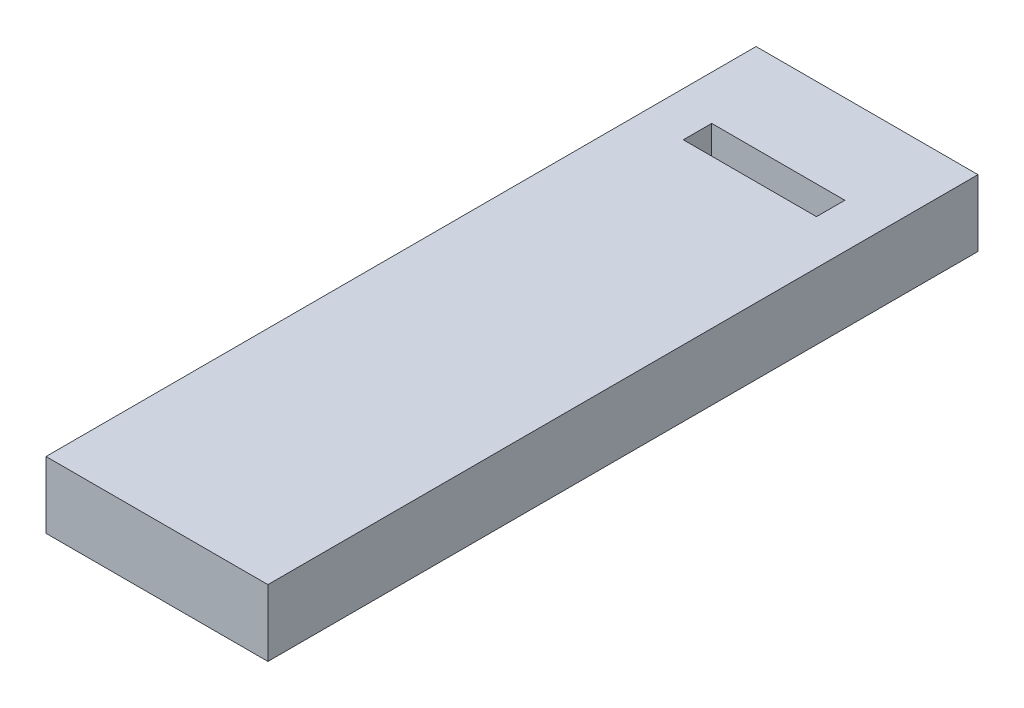
ISO-10303-21;
HEADER;
FILE_DESCRIPTION(('STEP AP214'),'2;1');
FILE_NAME('part.step','',(''),(''),'','','');
FILE_SCHEMA(('AUTOMOTIVE_DESIGN { 1 0 10303 214 1 1 1 1 }'));
ENDSEC;
DATA;
#1=APPLICATION_CONTEXT('core data for automotive mechanical design processes');
#2=APPLICATION_PROTOCOL_DEFINITION('international standard','automotive_design',2000,#1);
#3=PRODUCT_CONTEXT('',#1,'mechanical');
#4=PRODUCT('Part','Part','',(#3));
#5=PRODUCT_RELATED_PRODUCT_CATEGORY('part','',(#4));
#6=PRODUCT_DEFINITION_FORMATION('','',#4);
#7=PRODUCT_DEFINITION_CONTEXT('part definition',#1,'design');
#8=PRODUCT_DEFINITION('design','',#6,#7);
#9=PRODUCT_DEFINITION_SHAPE('','',#8);
#10=(LENGTH_UNIT() NAMED_UNIT(*) SI_UNIT(.MILLI.,.METRE.));
#11=(NAMED_UNIT(*) PLANE_ANGLE_UNIT() SI_UNIT($,.RADIAN.));
#12=(NAMED_UNIT(*) SI_UNIT($,.STERADIAN.) SOLID_ANGLE_UNIT());
#13=UNCERTAINTY_MEASURE_WITH_UNIT(LENGTH_MEASURE(1.E-05),#10,'distance_accuracy_value','');
#14=(GEOMETRIC_REPRESENTATION_CONTEXT(3) GLOBAL_UNCERTAINTY_ASSIGNED_CONTEXT((#13)) GLOBAL_UNIT_ASSIGNED_CONTEXT((#10,
#11,#12)) REPRESENTATION_CONTEXT('',''));
#15=CARTESIAN_POINT('',(0.,0.,0.));
#16=DIRECTION('',(0.,0.,1.));
#17=DIRECTION('',(1.,0.,0.));
#18=AXIS2_PLACEMENT_3D('',#15,#16,#17);
#19=CARTESIAN_POINT('',(0.,0.,0.));
#20=DIRECTION('',(0.,-1.,0.));
#21=DIRECTION('',(0.,0.,-1.));
#22=AXIS2_PLACEMENT_3D('',#19,#20,#21);
#23=PLANE('',#22);
#24=CARTESIAN_POINT('',(-23.8125,0.,-73.025));
#25=DIRECTION('',(0.,-1.,0.));
#26=DIRECTION('',(0.,0.,-1.));
#27=AXIS2_PLACEMENT_3D('',#24,#25,#26);
#28=CIRCLE('',#27,3.175);
#29=CARTESIAN_POINT('',(-26.9875,0.,-73.025));
#30=VERTEX_POINT('',#29);
#31=CARTESIAN_POINT('',(-23.8125,0.,-76.2));
#32=VERTEX_POINT('',#31);
#33=EDGE_CURVE('E335',#30,#32,#28,.T.);
#34=ORIENTED_EDGE('',*,*,#33,.F.);
#35=DIRECTION('',(0.,0.,-1.));
#36=VECTOR('',#35,1.);
#37=CARTESIAN_POINT('',(-26.9875,0.,90.4875));
#38=LINE('',#37,#36);
#39=CARTESIAN_POINT('',(-26.9875,0.,90.4875));
#40=VERTEX_POINT('',#39);
#41=EDGE_CURVE('E390',#40,#30,#38,.T.);
#42=ORIENTED_EDGE('',*,*,#41,.F.);
#43=CARTESIAN_POINT('',(-20.6375,0.,90.4875));
#44=DIRECTION('',(0.,-1.,0.));
#45=DIRECTION('',(0.,0.,-1.));
#46=AXIS2_PLACEMENT_3D('',#43,#44,#45);
#47=CIRCLE('',#46,6.35);
#48=CARTESIAN_POINT('',(-20.6375,0.,96.8375));
#49=VERTEX_POINT('',#48);
#50=EDGE_CURVE('E387',#49,#40,#47,.T.);
#51=ORIENTED_EDGE('',*,*,#50,.F.);
#52=DIRECTION('',(-1.,0.,0.));
#53=VECTOR('',#52,1.);
#54=CARTESIAN_POINT('',(20.6375,0.,96.8375));
#55=LINE('',#54,#53);
#56=CARTESIAN_POINT('',(20.6375,0.,96.8375));
#57=VERTEX_POINT('',#56);
#58=EDGE_CURVE('E384',#57,#49,#55,.T.);
#59=ORIENTED_EDGE('',*,*,#58,.F.);
#60=CARTESIAN_POINT('',(20.6375,0.,90.4875));
#61=DIRECTION('',(0.,-1.,0.));
#62=DIRECTION('',(0.,0.,-1.));
#63=AXIS2_PLACEMENT_3D('',#60,#61,#62);
#64=CIRCLE('',#63,6.35);
#65=CARTESIAN_POINT('',(26.9875,0.,90.4875));
#66=VERTEX_POINT('',#65);
#67=EDGE_CURVE('E346',#66,#57,#64,.T.);
#68=ORIENTED_EDGE('',*,*,#67,.F.);
#69=DIRECTION('',(0.,0.,1.));
#70=VECTOR('',#69,1.);
#71=CARTESIAN_POINT('',(26.9875,0.,90.4875));
#72=LINE('',#71,#70);
#73=CARTESIAN_POINT('',(26.9875,0.,-73.025));
#74=VERTEX_POINT('',#73);
#75=EDGE_CURVE('E366',#74,#66,#72,.T.);
#76=ORIENTED_EDGE('',*,*,#75,.F.);
#77=CARTESIAN_POINT('',(23.8125,0.,-73.025));
#78=DIRECTION('',(0.,-1.,0.));
#79=DIRECTION('',(0.,0.,-1.));
#80=AXIS2_PLACEMENT_3D('',#77,#78,#79);
#81=CIRCLE('',#80,3.175);
#82=CARTESIAN_POINT('',(23.8125,0.,-76.2));
#83=VERTEX_POINT('',#82);
#84=EDGE_CURVE('E316',#83,#74,#81,.T.);
#85=ORIENTED_EDGE('',*,*,#84,.F.);
#86=DIRECTION('',(1.,0.,0.));
#87=VECTOR('',#86,1.);
#88=CARTESIAN_POINT('',(23.8125,0.,-76.2));
#89=LINE('',#88,#87);
#90=CARTESIAN_POINT('',(4.76250000000001,0.,-76.2));
#91=VERTEX_POINT('',#90);
#92=EDGE_CURVE('E338',#91,#83,#89,.T.);
#93=ORIENTED_EDGE('',*,*,#92,.F.);
#94=DIRECTION('',(0.,0.,-1.));
#95=VECTOR('',#94,1.);
#96=CARTESIAN_POINT('',(4.76250000000001,0.,-76.2));
#97=LINE('',#96,#95);
#98=CARTESIAN_POINT('',(4.76250000000001,0.,-101.6));
#99=VERTEX_POINT('',#98);
#100=EDGE_CURVE('E281',#99,#91,#97,.F.);
#101=ORIENTED_EDGE('',*,*,#100,.F.);
#102=DIRECTION('',(-1.,0.,0.));
#103=VECTOR('',#102,1.);
#104=CARTESIAN_POINT('',(-31.75,0.,-101.6));
#105=LINE('',#104,#103);
#106=CARTESIAN_POINT('',(31.75,0.,-101.6));
#107=VERTEX_POINT('',#106);
#108=EDGE_CURVE('E264',#107,#99,#105,.T.);
#109=ORIENTED_EDGE('',*,*,#108,.F.);
#110=DIRECTION('',(0.,0.,-1.));
#111=VECTOR('',#110,1.);
#112=CARTESIAN_POINT('',(31.75,0.,101.6));
#113=LINE('',#112,#111);
#114=CARTESIAN_POINT('',(31.75,0.,101.6));
#115=VERTEX_POINT('',#114);
#116=EDGE_CURVE('E246',#115,#107,#113,.T.);
#117=ORIENTED_EDGE('',*,*,#116,.F.);
#118=DIRECTION('',(1.,0.,0.));
#119=VECTOR('',#118,1.);
#120=CARTESIAN_POINT('',(-31.75,0.,101.6));
#121=LINE('',#120,#119);
#122=CARTESIAN_POINT('',(-31.75,0.,101.6));
#123=VERTEX_POINT('',#122);
#124=EDGE_CURVE('E254',#123,#115,#121,.T.);
#125=ORIENTED_EDGE('',*,*,#124,.F.);
#126=DIRECTION('',(0.,0.,1.));
#127=VECTOR('',#126,1.);
#128=CARTESIAN_POINT('',(-31.75,0.,101.6));
#129=LINE('',#128,#127);
#130=CARTESIAN_POINT('',(-31.75,0.,-101.6));
#131=VERTEX_POINT('',#130);
#132=EDGE_CURVE('E267',#131,#123,#129,.T.);
#133=ORIENTED_EDGE('',*,*,#132,.F.);
#134=CARTESIAN_POINT('',(-4.76249999999999,0.,-101.6));
#135=VERTEX_POINT('',#134);
#136=EDGE_CURVE('E263',#135,#131,#105,.T.);
#137=ORIENTED_EDGE('',*,*,#136,.F.);
#138=DIRECTION('',(0.,0.,-1.));
#139=VECTOR('',#138,1.);
#140=CARTESIAN_POINT('',(-4.76249999999999,0.,-76.2));
#141=LINE('',#140,#139);
#142=CARTESIAN_POINT('',(-4.76249999999999,0.,-76.2));
#143=VERTEX_POINT('',#142);
#144=EDGE_CURVE('E284',#143,#135,#141,.T.);
#145=ORIENTED_EDGE('',*,*,#144,.F.);
#146=EDGE_CURVE('E339',#32,#143,#89,.T.);
#147=ORIENTED_EDGE('',*,*,#146,.F.);
#148=EDGE_LOOP('',(#34,#42,#51,#59,#68,#76,#85,#93,#101,#109,#117,#125,#133,#137,#145,#147));
#149=FACE_BOUND('',#148,.T.);
#150=ADVANCED_FACE('F33',(#149),#23,.T.);
#151=CARTESIAN_POINT('',(0.,19.05,0.));
#152=DIRECTION('',(0.,-1.,0.));
#153=DIRECTION('',(0.,0.,-1.));
#154=AXIS2_PLACEMENT_3D('',#151,#152,#153);
#155=PLANE('',#154);
#156=DIRECTION('',(0.,0.,-1.));
#157=VECTOR('',#156,1.);
#158=CARTESIAN_POINT('',(31.75,19.05,101.6));
#159=LINE('',#158,#157);
#160=CARTESIAN_POINT('',(31.75,19.05,101.6));
#161=VERTEX_POINT('',#160);
#162=CARTESIAN_POINT('',(31.75,19.05,-101.6));
#163=VERTEX_POINT('',#162);
#164=EDGE_CURVE('E250',#161,#163,#159,.T.);
#165=ORIENTED_EDGE('',*,*,#164,.T.);
#166=DIRECTION('',(-1.,0.,0.));
#167=VECTOR('',#166,1.);
#168=CARTESIAN_POINT('',(-31.75,19.05,-101.6));
#169=LINE('',#168,#167);
#170=CARTESIAN_POINT('',(-31.75,19.05,-101.6));
#171=VERTEX_POINT('',#170);
#172=EDGE_CURVE('E253',#163,#171,#169,.T.);
#173=ORIENTED_EDGE('',*,*,#172,.T.);
#174=DIRECTION('',(0.,0.,1.));
#175=VECTOR('',#174,1.);
#176=CARTESIAN_POINT('',(-31.75,19.05,101.6));
#177=LINE('',#176,#175);
#178=CARTESIAN_POINT('',(-31.75,19.05,101.6));
#179=VERTEX_POINT('',#178);
#180=EDGE_CURVE('E256',#171,#179,#177,.T.);
#181=ORIENTED_EDGE('',*,*,#180,.T.);
#182=DIRECTION('',(1.,0.,0.));
#183=VECTOR('',#182,1.);
#184=CARTESIAN_POINT('',(-31.75,19.05,101.6));
#185=LINE('',#184,#183);
#186=EDGE_CURVE('E258',#179,#161,#185,.T.);
#187=ORIENTED_EDGE('',*,*,#186,.T.);
#188=EDGE_LOOP('',(#165,#173,#181,#187));
#189=FACE_BOUND('',#188,.T.);
#190=DIRECTION('',(0.,0.,-1.));
#191=VECTOR('',#190,1.);
#192=CARTESIAN_POINT('',(19.05,19.05,-76.2));
#193=LINE('',#192,#191);
#194=CARTESIAN_POINT('',(19.05,19.05,-68.072));
#195=VERTEX_POINT('',#194);
#196=CARTESIAN_POINT('',(19.05,19.05,-76.2));
#197=VERTEX_POINT('',#196);
#198=EDGE_CURVE('E406',#195,#197,#193,.T.);
#199=ORIENTED_EDGE('',*,*,#198,.F.);
#200=DIRECTION('',(1.,0.,0.));
#201=VECTOR('',#200,1.);
#202=CARTESIAN_POINT('',(19.05,19.05,-68.072));
#203=LINE('',#202,#201);
#204=CARTESIAN_POINT('',(-19.05,19.05,-68.072));
#205=VERTEX_POINT('',#204);
#206=EDGE_CURVE('E415',#205,#195,#203,.T.);
#207=ORIENTED_EDGE('',*,*,#206,.F.);
#208=DIRECTION('',(0.,0.,1.));
#209=VECTOR('',#208,1.);
#210=CARTESIAN_POINT('',(-19.05,19.05,-76.2));
#211=LINE('',#210,#209);
#212=CARTESIAN_POINT('',(-19.05,19.05,-76.2));
#213=VERTEX_POINT('',#212);
#214=EDGE_CURVE('E413',#213,#205,#211,.T.);
#215=ORIENTED_EDGE('',*,*,#214,.F.);
#216=DIRECTION('',(-1.,0.,0.));
#217=VECTOR('',#216,1.);
#218=CARTESIAN_POINT('',(19.05,19.05,-76.2));
#219=LINE('',#218,#217);
#220=EDGE_CURVE('E411',#197,#213,#219,.T.);
#221=ORIENTED_EDGE('',*,*,#220,.F.);
#222=EDGE_LOOP('',(#199,#207,#215,#221));
#223=FACE_BOUND('',#222,.T.);
#224=ADVANCED_FACE('F426',(#189,#223),#155,.F.);
#225=CARTESIAN_POINT('',(-23.8125,9.525,-73.025));
#226=DIRECTION('',(0.,-1.,0.));
#227=DIRECTION('',(0.,0.,-1.));
#228=AXIS2_PLACEMENT_3D('',#225,#226,#227);
#229=PLANE('',#228);
#230=DIRECTION('',(-1.,0.,0.));
#231=VECTOR('',#230,1.);
#232=CARTESIAN_POINT('',(-23.8125,9.525,-68.072));
#233=LINE('',#232,#231);
#234=CARTESIAN_POINT('',(23.8125,9.525,-68.072));
#235=VERTEX_POINT('',#234);
#236=CARTESIAN_POINT('',(19.05,9.525,-68.072));
#237=VERTEX_POINT('',#236);
#238=EDGE_CURVE('E299',#235,#237,#233,.T.);
#239=ORIENTED_EDGE('',*,*,#238,.T.);
#240=DIRECTION('',(0.,0.,-1.));
#241=VECTOR('',#240,1.);
#242=CARTESIAN_POINT('',(19.05,9.525,-73.0249999999999));
#243=LINE('',#242,#241);
#244=CARTESIAN_POINT('',(19.05,9.525,-76.2));
#245=VERTEX_POINT('',#244);
#246=EDGE_CURVE('E41',#237,#245,#243,.T.);
#247=ORIENTED_EDGE('',*,*,#246,.T.);
#248=DIRECTION('',(1.,0.,0.));
#249=VECTOR('',#248,1.);
#250=CARTESIAN_POINT('',(23.8125,9.525,-76.2));
#251=LINE('',#250,#249);
#252=CARTESIAN_POINT('',(23.8125,9.525,-76.2));
#253=VERTEX_POINT('',#252);
#254=EDGE_CURVE('E295',#245,#253,#251,.T.);
#255=ORIENTED_EDGE('',*,*,#254,.T.);
#256=CARTESIAN_POINT('',(23.8125,9.525,-73.025));
#257=DIRECTION('',(0.,-1.,0.));
#258=DIRECTION('',(0.,0.,-1.));
#259=AXIS2_PLACEMENT_3D('',#256,#257,#258);
#260=CIRCLE('',#259,3.175);
#261=CARTESIAN_POINT('',(26.9875,9.525,-73.025));
#262=VERTEX_POINT('',#261);
#263=EDGE_CURVE('E314',#253,#262,#260,.T.);
#264=ORIENTED_EDGE('',*,*,#263,.T.);
#265=DIRECTION('',(0.,0.,1.));
#266=VECTOR('',#265,1.);
#267=CARTESIAN_POINT('',(26.9875,9.525,-71.247));
#268=LINE('',#267,#266);
#269=CARTESIAN_POINT('',(26.9875,9.525,-71.247));
#270=VERTEX_POINT('',#269);
#271=EDGE_CURVE('E321',#262,#270,#268,.T.);
#272=ORIENTED_EDGE('',*,*,#271,.T.);
#273=CARTESIAN_POINT('',(23.8125,9.525,-71.247));
#274=DIRECTION('',(0.,-1.,0.));
#275=DIRECTION('',(0.,0.,1.));
#276=AXIS2_PLACEMENT_3D('',#273,#274,#275);
#277=CIRCLE('',#276,3.17499999999999);
#278=EDGE_CURVE('E324',#270,#235,#277,.T.);
#279=ORIENTED_EDGE('',*,*,#278,.T.);
#280=EDGE_LOOP('',(#239,#247,#255,#264,#272,#279));
#281=FACE_BOUND('',#280,.T.);
#282=ADVANCED_FACE('F293',(#281),#229,.T.);
#283=CARTESIAN_POINT('',(-23.8125,9.525,-76.2));
#284=VERTEX_POINT('',#283);
#285=CARTESIAN_POINT('',(-19.05,9.525,-76.2));
#286=VERTEX_POINT('',#285);
#287=EDGE_CURVE('E310',#284,#286,#251,.T.);
#288=ORIENTED_EDGE('',*,*,#287,.T.);
#289=DIRECTION('',(0.,0.,1.));
#290=VECTOR('',#289,1.);
#291=CARTESIAN_POINT('',(-19.05,9.525,-73.025));
#292=LINE('',#291,#290);
#293=CARTESIAN_POINT('',(-19.05,9.525,-68.072));
#294=VERTEX_POINT('',#293);
#295=EDGE_CURVE('E286',#286,#294,#292,.T.);
#296=ORIENTED_EDGE('',*,*,#295,.T.);
#297=CARTESIAN_POINT('',(-23.8125,9.525,-68.072));
#298=VERTEX_POINT('',#297);
#299=EDGE_CURVE('E326',#294,#298,#233,.T.);
#300=ORIENTED_EDGE('',*,*,#299,.T.);
#301=CARTESIAN_POINT('',(-23.8125,9.525,-71.247));
#302=DIRECTION('',(0.,-1.,0.));
#303=DIRECTION('',(0.,0.,-1.));
#304=AXIS2_PLACEMENT_3D('',#301,#302,#303);
#305=CIRCLE('',#304,3.175);
#306=CARTESIAN_POINT('',(-26.9875,9.525,-71.247));
#307=VERTEX_POINT('',#306);
#308=EDGE_CURVE('E328',#298,#307,#305,.T.);
#309=ORIENTED_EDGE('',*,*,#308,.T.);
#310=DIRECTION('',(0.,0.,-1.));
#311=VECTOR('',#310,1.);
#312=CARTESIAN_POINT('',(-26.9875,9.525,-71.247));
#313=LINE('',#312,#311);
#314=CARTESIAN_POINT('',(-26.9875,9.525,-73.025));
#315=VERTEX_POINT('',#314);
#316=EDGE_CURVE('E331',#307,#315,#313,.T.);
#317=ORIENTED_EDGE('',*,*,#316,.T.);
#318=CARTESIAN_POINT('',(-23.8125,9.525,-73.025));
#319=DIRECTION('',(0.,-1.,0.));
#320=DIRECTION('',(0.,0.,-1.));
#321=AXIS2_PLACEMENT_3D('',#318,#319,#320);
#322=CIRCLE('',#321,3.175);
#323=EDGE_CURVE('E311',#315,#284,#322,.T.);
#324=ORIENTED_EDGE('',*,*,#323,.T.);
#325=EDGE_LOOP('',(#288,#296,#300,#309,#317,#324));
#326=FACE_BOUND('',#325,.T.);
#327=ADVANCED_FACE('F433',(#326),#229,.T.);
#328=CARTESIAN_POINT('',(31.75,19.05,101.6));
#329=DIRECTION('',(-1.,0.,0.));
#330=DIRECTION('',(0.,0.,1.));
#331=AXIS2_PLACEMENT_3D('',#328,#329,#330);
#332=PLANE('',#331);
#333=ORIENTED_EDGE('',*,*,#116,.T.);
#334=DIRECTION('',(0.,-1.,0.));
#335=VECTOR('',#334,1.);
#336=CARTESIAN_POINT('',(31.75,19.05,-101.6));
#337=LINE('',#336,#335);
#338=EDGE_CURVE('E278',#163,#107,#337,.T.);
#339=ORIENTED_EDGE('',*,*,#338,.F.);
#340=ORIENTED_EDGE('',*,*,#164,.F.);
#341=DIRECTION('',(0.,-1.,0.));
#342=VECTOR('',#341,1.);
#343=CARTESIAN_POINT('',(31.75,19.05,101.6));
#344=LINE('',#343,#342);
#345=EDGE_CURVE('E260',#161,#115,#344,.T.);
#346=ORIENTED_EDGE('',*,*,#345,.T.);
#347=EDGE_LOOP('',(#333,#339,#340,#346));
#348=FACE_BOUND('',#347,.T.);
#349=ADVANCED_FACE('F35',(#348),#332,.F.);
#350=CARTESIAN_POINT('',(-31.75,19.05,-101.6));
#351=DIRECTION('',(0.,0.,1.));
#352=DIRECTION('',(1.,0.,0.));
#353=AXIS2_PLACEMENT_3D('',#350,#351,#352);
#354=PLANE('',#353);
#355=ORIENTED_EDGE('',*,*,#108,.T.);
#356=CARTESIAN_POINT('',(0.,0.,-101.6));
#357=DIRECTION('',(0.,0.,-1.));
#358=DIRECTION('',(-1.,0.,0.));
#359=AXIS2_PLACEMENT_3D('',#356,#357,#358);
#360=CIRCLE('',#359,4.7625);
#361=EDGE_CURVE('E247',#135,#99,#360,.T.);
#362=ORIENTED_EDGE('',*,*,#361,.F.);
#363=ORIENTED_EDGE('',*,*,#136,.T.);
#364=DIRECTION('',(0.,-1.,0.));
#365=VECTOR('',#364,1.);
#366=CARTESIAN_POINT('',(-31.75,19.05,-101.6));
#367=LINE('',#366,#365);
#368=EDGE_CURVE('E275',#171,#131,#367,.T.);
#369=ORIENTED_EDGE('',*,*,#368,.F.);
#370=ORIENTED_EDGE('',*,*,#172,.F.);
#371=ORIENTED_EDGE('',*,*,#338,.T.);
#372=EDGE_LOOP('',(#355,#362,#363,#369,#370,#371));
#373=FACE_BOUND('',#372,.T.);
#374=ADVANCED_FACE('F460',(#373),#354,.F.);
#375=CARTESIAN_POINT('',(-31.75,19.05,101.6));
#376=DIRECTION('',(1.,0.,0.));
#377=DIRECTION('',(0.,0.,-1.));
#378=AXIS2_PLACEMENT_3D('',#375,#376,#377);
#379=PLANE('',#378);
#380=ORIENTED_EDGE('',*,*,#132,.T.);
#381=DIRECTION('',(0.,-1.,0.));
#382=VECTOR('',#381,1.);
#383=CARTESIAN_POINT('',(-31.75,19.05,101.6));
#384=LINE('',#383,#382);
#385=EDGE_CURVE('E272',#179,#123,#384,.T.);
#386=ORIENTED_EDGE('',*,*,#385,.F.);
#387=ORIENTED_EDGE('',*,*,#180,.F.);
#388=ORIENTED_EDGE('',*,*,#368,.T.);
#389=EDGE_LOOP('',(#380,#386,#387,#388));
#390=FACE_BOUND('',#389,.T.);
#391=ADVANCED_FACE('F463',(#390),#379,.F.);
#392=CARTESIAN_POINT('',(-31.75,19.05,101.6));
#393=DIRECTION('',(0.,0.,-1.));
#394=DIRECTION('',(-1.,0.,0.));
#395=AXIS2_PLACEMENT_3D('',#392,#393,#394);
#396=PLANE('',#395);
#397=ORIENTED_EDGE('',*,*,#124,.T.);
#398=ORIENTED_EDGE('',*,*,#345,.F.);
#399=ORIENTED_EDGE('',*,*,#186,.F.);
#400=ORIENTED_EDGE('',*,*,#385,.T.);
#401=EDGE_LOOP('',(#397,#398,#399,#400));
#402=FACE_BOUND('',#401,.T.);
#403=ADVANCED_FACE('F498',(#402),#396,.F.);
#404=CARTESIAN_POINT('',(0.,0.,-76.2));
#405=DIRECTION('',(0.,0.,-1.));
#406=DIRECTION('',(-1.,0.,0.));
#407=AXIS2_PLACEMENT_3D('',#404,#405,#406);
#408=CYLINDRICAL_SURFACE('',#407,4.7625);
#409=ORIENTED_EDGE('',*,*,#144,.T.);
#410=ORIENTED_EDGE('',*,*,#361,.T.);
#411=ORIENTED_EDGE('',*,*,#100,.T.);
#412=CARTESIAN_POINT('',(0.,0.,-76.2));
#413=DIRECTION('',(0.,0.,-1.));
#414=DIRECTION('',(-1.,0.,0.));
#415=AXIS2_PLACEMENT_3D('',#412,#413,#414);
#416=CIRCLE('',#415,4.7625);
#417=EDGE_CURVE('E244',#143,#91,#416,.T.);
#418=ORIENTED_EDGE('',*,*,#417,.F.);
#419=EDGE_LOOP('',(#409,#410,#411,#418));
#420=FACE_BOUND('',#419,.T.);
#421=ADVANCED_FACE('F452',(#420),#408,.F.);
#422=CARTESIAN_POINT('',(20.6375,9.525,90.4875));
#423=DIRECTION('',(0.,-1.,0.));
#424=DIRECTION('',(0.,0.,-1.));
#425=AXIS2_PLACEMENT_3D('',#422,#423,#424);
#426=CYLINDRICAL_SURFACE('',#425,6.35);
#427=ORIENTED_EDGE('',*,*,#67,.T.);
#428=DIRECTION('',(0.,-1.,0.));
#429=VECTOR('',#428,1.);
#430=CARTESIAN_POINT('',(20.6375,9.525,96.8375));
#431=LINE('',#430,#429);
#432=CARTESIAN_POINT('',(20.6375,9.525,96.8375));
#433=VERTEX_POINT('',#432);
#434=EDGE_CURVE('E240',#433,#57,#431,.T.);
#435=ORIENTED_EDGE('',*,*,#434,.F.);
#436=CARTESIAN_POINT('',(20.6375,9.525,90.4875));
#437=DIRECTION('',(0.,-1.,0.));
#438=DIRECTION('',(0.,0.,-1.));
#439=AXIS2_PLACEMENT_3D('',#436,#437,#438);
#440=CIRCLE('',#439,6.35);
#441=CARTESIAN_POINT('',(26.9875,9.525,90.4875));
#442=VERTEX_POINT('',#441);
#443=EDGE_CURVE('E362',#442,#433,#440,.T.);
#444=ORIENTED_EDGE('',*,*,#443,.F.);
#445=DIRECTION('',(0.,-1.,0.));
#446=VECTOR('',#445,1.);
#447=CARTESIAN_POINT('',(26.9875,9.525,90.4875));
#448=LINE('',#447,#446);
#449=EDGE_CURVE('E249',#442,#66,#448,.T.);
#450=ORIENTED_EDGE('',*,*,#449,.T.);
#451=EDGE_LOOP('',(#427,#435,#444,#450));
#452=FACE_BOUND('',#451,.T.);
#453=ADVANCED_FACE('F534',(#452),#426,.F.);
#454=CARTESIAN_POINT('',(26.9875,9.525,90.4875));
#455=DIRECTION('',(1.,0.,0.));
#456=DIRECTION('',(0.,0.,-1.));
#457=AXIS2_PLACEMENT_3D('',#454,#455,#456);
#458=PLANE('',#457);
#459=ORIENTED_EDGE('',*,*,#75,.T.);
#460=ORIENTED_EDGE('',*,*,#449,.F.);
#461=DIRECTION('',(0.,0.,1.));
#462=VECTOR('',#461,1.);
#463=CARTESIAN_POINT('',(26.9875,9.525,90.4875));
#464=LINE('',#463,#462);
#465=CARTESIAN_POINT('',(26.9875,9.525,-37.592));
#466=VERTEX_POINT('',#465);
#467=EDGE_CURVE('E243',#466,#442,#464,.T.);
#468=ORIENTED_EDGE('',*,*,#467,.F.);
#469=DIRECTION('',(0.,-1.,0.));
#470=VECTOR('',#469,1.);
#471=CARTESIAN_POINT('',(26.9875,9.525,-37.592));
#472=LINE('',#471,#470);
#473=CARTESIAN_POINT('',(26.9875,2.159,-37.592));
#474=VERTEX_POINT('',#473);
#475=EDGE_CURVE('E395',#466,#474,#472,.T.);
#476=ORIENTED_EDGE('',*,*,#475,.T.);
#477=DIRECTION('',(0.,0.,-1.));
#478=VECTOR('',#477,1.);
#479=CARTESIAN_POINT('',(26.9875,2.159,-71.247));
#480=LINE('',#479,#478);
#481=CARTESIAN_POINT('',(26.9875,2.159,-71.247));
#482=VERTEX_POINT('',#481);
#483=EDGE_CURVE('E48',#474,#482,#480,.T.);
#484=ORIENTED_EDGE('',*,*,#483,.T.);
#485=DIRECTION('',(0.,-1.,0.));
#486=VECTOR('',#485,1.);
#487=CARTESIAN_POINT('',(26.9875,9.525,-71.247));
#488=LINE('',#487,#486);
#489=EDGE_CURVE('E354',#270,#482,#488,.T.);
#490=ORIENTED_EDGE('',*,*,#489,.F.);
#491=ORIENTED_EDGE('',*,*,#271,.F.);
#492=DIRECTION('',(0.,-1.,0.));
#493=VECTOR('',#492,1.);
#494=CARTESIAN_POINT('',(26.9875,9.525,-73.025));
#495=LINE('',#494,#493);
#496=EDGE_CURVE('E357',#262,#74,#495,.T.);
#497=ORIENTED_EDGE('',*,*,#496,.T.);
#498=EDGE_LOOP('',(#459,#460,#468,#476,#484,#490,#491,#497));
#499=FACE_BOUND('',#498,.T.);
#500=ADVANCED_FACE('F477',(#499),#458,.F.);
#501=CARTESIAN_POINT('',(20.6375,9.525,-37.592));
#502=DIRECTION('',(0.,-1.,0.));
#503=DIRECTION('',(0.,0.,-1.));
#504=AXIS2_PLACEMENT_3D('',#501,#502,#503);
#505=CYLINDRICAL_SURFACE('',#504,6.35000000000001);
#506=DIRECTION('',(0.,-1.,0.));
#507=VECTOR('',#506,1.);
#508=CARTESIAN_POINT('',(20.6375,9.525,-43.942));
#509=LINE('',#508,#507);
#510=CARTESIAN_POINT('',(20.6375,9.525,-43.942));
#511=VERTEX_POINT('',#510);
#512=CARTESIAN_POINT('',(20.6375,2.159,-43.942));
#513=VERTEX_POINT('',#512);
#514=EDGE_CURVE('E233',#511,#513,#509,.T.);
#515=ORIENTED_EDGE('',*,*,#514,.T.);
#516=CARTESIAN_POINT('',(20.6375,2.159,-37.592));
#517=DIRECTION('',(0.,1.,0.));
#518=DIRECTION('',(0.,0.,1.));
#519=AXIS2_PLACEMENT_3D('',#516,#517,#518);
#520=CIRCLE('',#519,6.35000000000001);
#521=EDGE_CURVE('E401',#513,#474,#520,.F.);
#522=ORIENTED_EDGE('',*,*,#521,.T.);
#523=ORIENTED_EDGE('',*,*,#475,.F.);
#524=CARTESIAN_POINT('',(20.6375,9.525,-37.592));
#525=DIRECTION('',(0.,-1.,0.));
#526=DIRECTION('',(0.,0.,-1.));
#527=AXIS2_PLACEMENT_3D('',#524,#525,#526);
#528=CIRCLE('',#527,6.35000000000001);
#529=EDGE_CURVE('E378',#511,#466,#528,.T.);
#530=ORIENTED_EDGE('',*,*,#529,.F.);
#531=EDGE_LOOP('',(#515,#522,#523,#530));
#532=FACE_BOUND('',#531,.T.);
#533=ADVANCED_FACE('F400',(#532),#505,.F.);
#534=CARTESIAN_POINT('',(-20.6375,9.525,-43.942));
#535=DIRECTION('',(0.,0.,-1.));
#536=DIRECTION('',(-1.,0.,0.));
#537=AXIS2_PLACEMENT_3D('',#534,#535,#536);
#538=PLANE('',#537);
#539=DIRECTION('',(0.,-1.,0.));
#540=VECTOR('',#539,1.);
#541=CARTESIAN_POINT('',(-20.6375,9.525,-43.942));
#542=LINE('',#541,#540);
#543=CARTESIAN_POINT('',(-20.6375,9.525,-43.942));
#544=VERTEX_POINT('',#543);
#545=CARTESIAN_POINT('',(-20.6375,2.159,-43.942));
#546=VERTEX_POINT('',#545);
#547=EDGE_CURVE('E230',#544,#546,#542,.T.);
#548=ORIENTED_EDGE('',*,*,#547,.T.);
#549=DIRECTION('',(1.,0.,0.));
#550=VECTOR('',#549,1.);
#551=CARTESIAN_POINT('',(-20.6375,2.159,-43.942));
#552=LINE('',#551,#550);
#553=EDGE_CURVE('E211',#546,#513,#552,.T.);
#554=ORIENTED_EDGE('',*,*,#553,.T.);
#555=ORIENTED_EDGE('',*,*,#514,.F.);
#556=DIRECTION('',(1.,0.,0.));
#557=VECTOR('',#556,1.);
#558=CARTESIAN_POINT('',(-20.6375,9.525,-43.942));
#559=LINE('',#558,#557);
#560=EDGE_CURVE('E375',#544,#511,#559,.T.);
#561=ORIENTED_EDGE('',*,*,#560,.F.);
#562=EDGE_LOOP('',(#548,#554,#555,#561));
#563=FACE_BOUND('',#562,.T.);
#564=ADVANCED_FACE('F404',(#563),#538,.F.);
#565=CARTESIAN_POINT('',(-20.6375,9.525,-37.592));
#566=DIRECTION('',(0.,-1.,0.));
#567=DIRECTION('',(0.,0.,-1.));
#568=AXIS2_PLACEMENT_3D('',#565,#566,#567);
#569=CYLINDRICAL_SURFACE('',#568,6.35);
#570=DIRECTION('',(0.,-1.,0.));
#571=VECTOR('',#570,1.);
#572=CARTESIAN_POINT('',(-26.9875,9.525,-37.592));
#573=LINE('',#572,#571);
#574=CARTESIAN_POINT('',(-26.9875,9.525,-37.592));
#575=VERTEX_POINT('',#574);
#576=CARTESIAN_POINT('',(-26.9875,2.159,-37.592));
#577=VERTEX_POINT('',#576);
#578=EDGE_CURVE('E221',#575,#577,#573,.T.);
#579=ORIENTED_EDGE('',*,*,#578,.T.);
#580=CARTESIAN_POINT('',(-20.6375,2.159,-37.592));
#581=DIRECTION('',(0.,1.,0.));
#582=DIRECTION('',(0.,0.,1.));
#583=AXIS2_PLACEMENT_3D('',#580,#581,#582);
#584=CIRCLE('',#583,6.35);
#585=EDGE_CURVE('E205',#577,#546,#584,.F.);
#586=ORIENTED_EDGE('',*,*,#585,.T.);
#587=ORIENTED_EDGE('',*,*,#547,.F.);
#588=CARTESIAN_POINT('',(-20.6375,9.525,-37.592));
#589=DIRECTION('',(0.,-1.,0.));
#590=DIRECTION('',(0.,0.,1.));
#591=AXIS2_PLACEMENT_3D('',#588,#589,#590);
#592=CIRCLE('',#591,6.35);
#593=EDGE_CURVE('E228',#575,#544,#592,.T.);
#594=ORIENTED_EDGE('',*,*,#593,.F.);
#595=EDGE_LOOP('',(#579,#586,#587,#594));
#596=FACE_BOUND('',#595,.T.);
#597=ADVANCED_FACE('F226',(#596),#569,.F.);
#598=CARTESIAN_POINT('',(-26.9875,9.525,90.4875));
#599=DIRECTION('',(-1.,0.,0.));
#600=DIRECTION('',(0.,0.,1.));
#601=AXIS2_PLACEMENT_3D('',#598,#599,#600);
#602=PLANE('',#601);
#603=ORIENTED_EDGE('',*,*,#41,.T.);
#604=DIRECTION('',(0.,-1.,0.));
#605=VECTOR('',#604,1.);
#606=CARTESIAN_POINT('',(-26.9875,9.525,-73.025));
#607=LINE('',#606,#605);
#608=EDGE_CURVE('E343',#315,#30,#607,.T.);
#609=ORIENTED_EDGE('',*,*,#608,.F.);
#610=ORIENTED_EDGE('',*,*,#316,.F.);
#611=DIRECTION('',(0.,-1.,0.));
#612=VECTOR('',#611,1.);
#613=CARTESIAN_POINT('',(-26.9875,9.525,-71.247));
#614=LINE('',#613,#612);
#615=CARTESIAN_POINT('',(-26.9875,2.159,-71.247));
#616=VERTEX_POINT('',#615);
#617=EDGE_CURVE('E224',#307,#616,#614,.T.);
#618=ORIENTED_EDGE('',*,*,#617,.T.);
#619=DIRECTION('',(0.,0.,1.));
#620=VECTOR('',#619,1.);
#621=CARTESIAN_POINT('',(-26.9875,2.159,-71.247));
#622=LINE('',#621,#620);
#623=EDGE_CURVE('E208',#616,#577,#622,.T.);
#624=ORIENTED_EDGE('',*,*,#623,.T.);
#625=ORIENTED_EDGE('',*,*,#578,.F.);
#626=DIRECTION('',(0.,0.,-1.));
#627=VECTOR('',#626,1.);
#628=CARTESIAN_POINT('',(-26.9875,9.525,90.4875));
#629=LINE('',#628,#627);
#630=CARTESIAN_POINT('',(-26.9875,9.525,90.4875));
#631=VERTEX_POINT('',#630);
#632=EDGE_CURVE('E372',#631,#575,#629,.T.);
#633=ORIENTED_EDGE('',*,*,#632,.F.);
#634=DIRECTION('',(0.,-1.,0.));
#635=VECTOR('',#634,1.);
#636=CARTESIAN_POINT('',(-26.9875,9.525,90.4875));
#637=LINE('',#636,#635);
#638=EDGE_CURVE('E231',#631,#40,#637,.T.);
#639=ORIENTED_EDGE('',*,*,#638,.T.);
#640=EDGE_LOOP('',(#603,#609,#610,#618,#624,#625,#633,#639));
#641=FACE_BOUND('',#640,.T.);
#642=ADVANCED_FACE('F219',(#641),#602,.F.);
#643=CARTESIAN_POINT('',(-20.6375,9.525,90.4875));
#644=DIRECTION('',(0.,-1.,0.));
#645=DIRECTION('',(0.,0.,-1.));
#646=AXIS2_PLACEMENT_3D('',#643,#644,#645);
#647=CYLINDRICAL_SURFACE('',#646,6.35);
#648=ORIENTED_EDGE('',*,*,#50,.T.);
#649=ORIENTED_EDGE('',*,*,#638,.F.);
#650=CARTESIAN_POINT('',(-20.6375,9.525,90.4875));
#651=DIRECTION('',(0.,-1.,0.));
#652=DIRECTION('',(0.,0.,-1.));
#653=AXIS2_PLACEMENT_3D('',#650,#651,#652);
#654=CIRCLE('',#653,6.35);
#655=CARTESIAN_POINT('',(-20.6375,9.525,96.8375));
#656=VERTEX_POINT('',#655);
#657=EDGE_CURVE('E369',#656,#631,#654,.T.);
#658=ORIENTED_EDGE('',*,*,#657,.F.);
#659=DIRECTION('',(0.,-1.,0.));
#660=VECTOR('',#659,1.);
#661=CARTESIAN_POINT('',(-20.6375,9.525,96.8375));
#662=LINE('',#661,#660);
#663=EDGE_CURVE('E235',#656,#49,#662,.T.);
#664=ORIENTED_EDGE('',*,*,#663,.T.);
#665=EDGE_LOOP('',(#648,#649,#658,#664));
#666=FACE_BOUND('',#665,.T.);
#667=ADVANCED_FACE('F543',(#666),#647,.F.);
#668=CARTESIAN_POINT('',(20.6375,9.525,96.8375));
#669=DIRECTION('',(0.,0.,1.));
#670=DIRECTION('',(1.,0.,0.));
#671=AXIS2_PLACEMENT_3D('',#668,#669,#670);
#672=PLANE('',#671);
#673=ORIENTED_EDGE('',*,*,#58,.T.);
#674=ORIENTED_EDGE('',*,*,#663,.F.);
#675=DIRECTION('',(-1.,0.,0.));
#676=VECTOR('',#675,1.);
#677=CARTESIAN_POINT('',(20.6375,9.525,96.8375));
#678=LINE('',#677,#676);
#679=EDGE_CURVE('E365',#433,#656,#678,.T.);
#680=ORIENTED_EDGE('',*,*,#679,.F.);
#681=ORIENTED_EDGE('',*,*,#434,.T.);
#682=EDGE_LOOP('',(#673,#674,#680,#681));
#683=FACE_BOUND('',#682,.T.);
#684=ADVANCED_FACE('F530',(#683),#672,.F.);
#685=CARTESIAN_POINT('',(20.6375,9.525,90.4875));
#686=DIRECTION('',(0.,-1.,0.));
#687=DIRECTION('',(0.,0.,-1.));
#688=AXIS2_PLACEMENT_3D('',#685,#686,#687);
#689=PLANE('',#688);
#690=ORIENTED_EDGE('',*,*,#443,.T.);
#691=ORIENTED_EDGE('',*,*,#679,.T.);
#692=ORIENTED_EDGE('',*,*,#657,.T.);
#693=ORIENTED_EDGE('',*,*,#632,.T.);
#694=ORIENTED_EDGE('',*,*,#593,.T.);
#695=ORIENTED_EDGE('',*,*,#560,.T.);
#696=ORIENTED_EDGE('',*,*,#529,.T.);
#697=ORIENTED_EDGE('',*,*,#467,.T.);
#698=EDGE_LOOP('',(#690,#691,#692,#693,#694,#695,#696,#697));
#699=FACE_BOUND('',#698,.T.);
#700=ADVANCED_FACE('F525',(#699),#689,.T.);
#701=CARTESIAN_POINT('',(23.8125,9.525,-76.2));
#702=DIRECTION('',(0.,0.,-1.));
#703=DIRECTION('',(-1.,0.,0.));
#704=AXIS2_PLACEMENT_3D('',#701,#702,#703);
#705=PLANE('',#704);
#706=ORIENTED_EDGE('',*,*,#92,.T.);
#707=DIRECTION('',(0.,-1.,0.));
#708=VECTOR('',#707,1.);
#709=CARTESIAN_POINT('',(23.8125,9.525,-76.2));
#710=LINE('',#709,#708);
#711=EDGE_CURVE('E308',#253,#83,#710,.T.);
#712=ORIENTED_EDGE('',*,*,#711,.F.);
#713=ORIENTED_EDGE('',*,*,#254,.F.);
#714=DIRECTION('',(0.,-1.,0.));
#715=VECTOR('',#714,1.);
#716=CARTESIAN_POINT('',(19.05,19.05,-76.2));
#717=LINE('',#716,#715);
#718=EDGE_CURVE('E305',#197,#245,#717,.T.);
#719=ORIENTED_EDGE('',*,*,#718,.F.);
#720=ORIENTED_EDGE('',*,*,#220,.T.);
#721=DIRECTION('',(0.,-1.,0.));
#722=VECTOR('',#721,1.);
#723=CARTESIAN_POINT('',(-19.05,19.05,-76.2));
#724=LINE('',#723,#722);
#725=EDGE_CURVE('E420',#213,#286,#724,.T.);
#726=ORIENTED_EDGE('',*,*,#725,.T.);
#727=ORIENTED_EDGE('',*,*,#287,.F.);
#728=DIRECTION('',(0.,-1.,0.));
#729=VECTOR('',#728,1.);
#730=CARTESIAN_POINT('',(-23.8125,9.525,-76.2));
#731=LINE('',#730,#729);
#732=EDGE_CURVE('E334',#284,#32,#731,.T.);
#733=ORIENTED_EDGE('',*,*,#732,.T.);
#734=ORIENTED_EDGE('',*,*,#146,.T.);
#735=ORIENTED_EDGE('',*,*,#417,.T.);
#736=EDGE_LOOP('',(#706,#712,#713,#719,#720,#726,#727,#733,#734,#735));
#737=FACE_BOUND('',#736,.T.);
#738=ADVANCED_FACE('F304',(#737),#705,.F.);
#739=CARTESIAN_POINT('',(-23.8125,9.525,-73.025));
#740=DIRECTION('',(0.,-1.,0.));
#741=DIRECTION('',(0.,0.,-1.));
#742=AXIS2_PLACEMENT_3D('',#739,#740,#741);
#743=CYLINDRICAL_SURFACE('',#742,3.175);
#744=ORIENTED_EDGE('',*,*,#33,.T.);
#745=ORIENTED_EDGE('',*,*,#732,.F.);
#746=ORIENTED_EDGE('',*,*,#323,.F.);
#747=ORIENTED_EDGE('',*,*,#608,.T.);
#748=EDGE_LOOP('',(#744,#745,#746,#747));
#749=FACE_BOUND('',#748,.T.);
#750=ADVANCED_FACE('F445',(#749),#743,.F.);
#751=CARTESIAN_POINT('',(-23.8125,9.525,-71.247));
#752=DIRECTION('',(0.,-1.,0.));
#753=DIRECTION('',(0.,0.,-1.));
#754=AXIS2_PLACEMENT_3D('',#751,#752,#753);
#755=CYLINDRICAL_SURFACE('',#754,3.175);
#756=DIRECTION('',(0.,-1.,0.));
#757=VECTOR('',#756,1.);
#758=CARTESIAN_POINT('',(-23.8125,9.525,-68.072));
#759=LINE('',#758,#757);
#760=CARTESIAN_POINT('',(-23.8125,2.159,-68.072));
#761=VERTEX_POINT('',#760);
#762=EDGE_CURVE('E348',#298,#761,#759,.T.);
#763=ORIENTED_EDGE('',*,*,#762,.T.);
#764=CARTESIAN_POINT('',(-23.8125,2.159,-71.247));
#765=DIRECTION('',(0.,1.,0.));
#766=DIRECTION('',(0.,0.,1.));
#767=AXIS2_PLACEMENT_3D('',#764,#765,#766);
#768=CIRCLE('',#767,3.175);
#769=EDGE_CURVE('E215',#761,#616,#768,.F.);
#770=ORIENTED_EDGE('',*,*,#769,.T.);
#771=ORIENTED_EDGE('',*,*,#617,.F.);
#772=ORIENTED_EDGE('',*,*,#308,.F.);
#773=EDGE_LOOP('',(#763,#770,#771,#772));
#774=FACE_BOUND('',#773,.T.);
#775=ADVANCED_FACE('F440',(#774),#755,.F.);
#776=CARTESIAN_POINT('',(-23.8125,9.525,-68.072));
#777=DIRECTION('',(0.,0.,1.));
#778=DIRECTION('',(1.,0.,0.));
#779=AXIS2_PLACEMENT_3D('',#776,#777,#778);
#780=PLANE('',#779);
#781=DIRECTION('',(0.,-1.,0.));
#782=VECTOR('',#781,1.);
#783=CARTESIAN_POINT('',(23.8125,9.525,-68.072));
#784=LINE('',#783,#782);
#785=CARTESIAN_POINT('',(23.8125,2.159,-68.072));
#786=VERTEX_POINT('',#785);
#787=EDGE_CURVE('E351',#235,#786,#784,.T.);
#788=ORIENTED_EDGE('',*,*,#787,.T.);
#789=DIRECTION('',(-1.,0.,0.));
#790=VECTOR('',#789,1.);
#791=CARTESIAN_POINT('',(-23.8125,2.159,-68.072));
#792=LINE('',#791,#790);
#793=EDGE_CURVE('E438',#786,#761,#792,.T.);
#794=ORIENTED_EDGE('',*,*,#793,.T.);
#795=ORIENTED_EDGE('',*,*,#762,.F.);
#796=ORIENTED_EDGE('',*,*,#299,.F.);
#797=DIRECTION('',(0.,-1.,0.));
#798=VECTOR('',#797,1.);
#799=CARTESIAN_POINT('',(-19.05,19.05,-68.072));
#800=LINE('',#799,#798);
#801=EDGE_CURVE('E56',#205,#294,#800,.T.);
#802=ORIENTED_EDGE('',*,*,#801,.F.);
#803=ORIENTED_EDGE('',*,*,#206,.T.);
#804=DIRECTION('',(0.,-1.,0.));
#805=VECTOR('',#804,1.);
#806=CARTESIAN_POINT('',(19.05,19.05,-68.072));
#807=LINE('',#806,#805);
#808=EDGE_CURVE('E417',#195,#237,#807,.T.);
#809=ORIENTED_EDGE('',*,*,#808,.T.);
#810=ORIENTED_EDGE('',*,*,#238,.F.);
#811=EDGE_LOOP('',(#788,#794,#795,#796,#802,#803,#809,#810));
#812=FACE_BOUND('',#811,.T.);
#813=ADVANCED_FACE('F435',(#812),#780,.F.);
#814=CARTESIAN_POINT('',(23.8125,9.525,-71.247));
#815=DIRECTION('',(0.,-1.,0.));
#816=DIRECTION('',(0.,0.,-1.));
#817=AXIS2_PLACEMENT_3D('',#814,#815,#816);
#818=CYLINDRICAL_SURFACE('',#817,3.17499999999999);
#819=ORIENTED_EDGE('',*,*,#489,.T.);
#820=CARTESIAN_POINT('',(23.8125,2.159,-71.247));
#821=DIRECTION('',(0.,1.,0.));
#822=DIRECTION('',(0.,0.,1.));
#823=AXIS2_PLACEMENT_3D('',#820,#821,#822);
#824=CIRCLE('',#823,3.17499999999999);
#825=EDGE_CURVE('E11',#482,#786,#824,.F.);
#826=ORIENTED_EDGE('',*,*,#825,.T.);
#827=ORIENTED_EDGE('',*,*,#787,.F.);
#828=ORIENTED_EDGE('',*,*,#278,.F.);
#829=EDGE_LOOP('',(#819,#826,#827,#828));
#830=FACE_BOUND('',#829,.T.);
#831=ADVANCED_FACE('F479',(#830),#818,.F.);
#832=CARTESIAN_POINT('',(23.8125,9.525,-73.025));
#833=DIRECTION('',(0.,-1.,0.));
#834=DIRECTION('',(0.,0.,-1.));
#835=AXIS2_PLACEMENT_3D('',#832,#833,#834);
#836=CYLINDRICAL_SURFACE('',#835,3.175);
#837=ORIENTED_EDGE('',*,*,#84,.T.);
#838=ORIENTED_EDGE('',*,*,#496,.F.);
#839=ORIENTED_EDGE('',*,*,#263,.F.);
#840=ORIENTED_EDGE('',*,*,#711,.T.);
#841=EDGE_LOOP('',(#837,#838,#839,#840));
#842=FACE_BOUND('',#841,.T.);
#843=ADVANCED_FACE('F474',(#842),#836,.F.);
#844=CARTESIAN_POINT('',(19.05,19.05,-76.2));
#845=DIRECTION('',(-1.,0.,0.));
#846=DIRECTION('',(0.,0.,1.));
#847=AXIS2_PLACEMENT_3D('',#844,#845,#846);
#848=PLANE('',#847);
#849=ORIENTED_EDGE('',*,*,#808,.F.);
#850=ORIENTED_EDGE('',*,*,#198,.T.);
#851=ORIENTED_EDGE('',*,*,#718,.T.);
#852=ORIENTED_EDGE('',*,*,#246,.F.);
#853=EDGE_LOOP('',(#849,#850,#851,#852));
#854=FACE_BOUND('',#853,.T.);
#855=ADVANCED_FACE('F422',(#854),#848,.T.);
#856=CARTESIAN_POINT('',(-19.05,19.05,-76.2));
#857=DIRECTION('',(1.,0.,0.));
#858=DIRECTION('',(0.,0.,-1.));
#859=AXIS2_PLACEMENT_3D('',#856,#857,#858);
#860=PLANE('',#859);
#861=ORIENTED_EDGE('',*,*,#725,.F.);
#862=ORIENTED_EDGE('',*,*,#214,.T.);
#863=ORIENTED_EDGE('',*,*,#801,.T.);
#864=ORIENTED_EDGE('',*,*,#295,.F.);
#865=EDGE_LOOP('',(#861,#862,#863,#864));
#866=FACE_BOUND('',#865,.T.);
#867=ADVANCED_FACE('F431',(#866),#860,.T.);
#868=CARTESIAN_POINT('',(0.,2.159,0.));
#869=DIRECTION('',(0.,1.,0.));
#870=DIRECTION('',(0.,0.,1.));
#871=AXIS2_PLACEMENT_3D('',#868,#869,#870);
#872=PLANE('',#871);
#873=ORIENTED_EDGE('',*,*,#553,.F.);
#874=ORIENTED_EDGE('',*,*,#585,.F.);
#875=ORIENTED_EDGE('',*,*,#623,.F.);
#876=ORIENTED_EDGE('',*,*,#769,.F.);
#877=ORIENTED_EDGE('',*,*,#793,.F.);
#878=ORIENTED_EDGE('',*,*,#825,.F.);
#879=ORIENTED_EDGE('',*,*,#483,.F.);
#880=ORIENTED_EDGE('',*,*,#521,.F.);
#881=EDGE_LOOP('',(#873,#874,#875,#876,#877,#878,#879,#880));
#882=FACE_BOUND('',#881,.T.);
#883=ADVANCED_FACE('F207',(#882),#872,.F.);
#884=CLOSED_SHELL('',(#150,#224,#282,#327,#349,#374,#391,#403,#421,#453,#500,#533,#564,#597,
#642,#667,#684,#700,#738,#750,#775,#813,#831,#843,#855,#867,#883));
#885=MANIFOLD_SOLID_BREP('B2',#884);
#886=ADVANCED_BREP_SHAPE_REPRESENTATION('',(#18,#885),#14);
#887=SHAPE_DEFINITION_REPRESENTATION(#9,#886);
ENDSEC;
END-ISO-10303-21;
